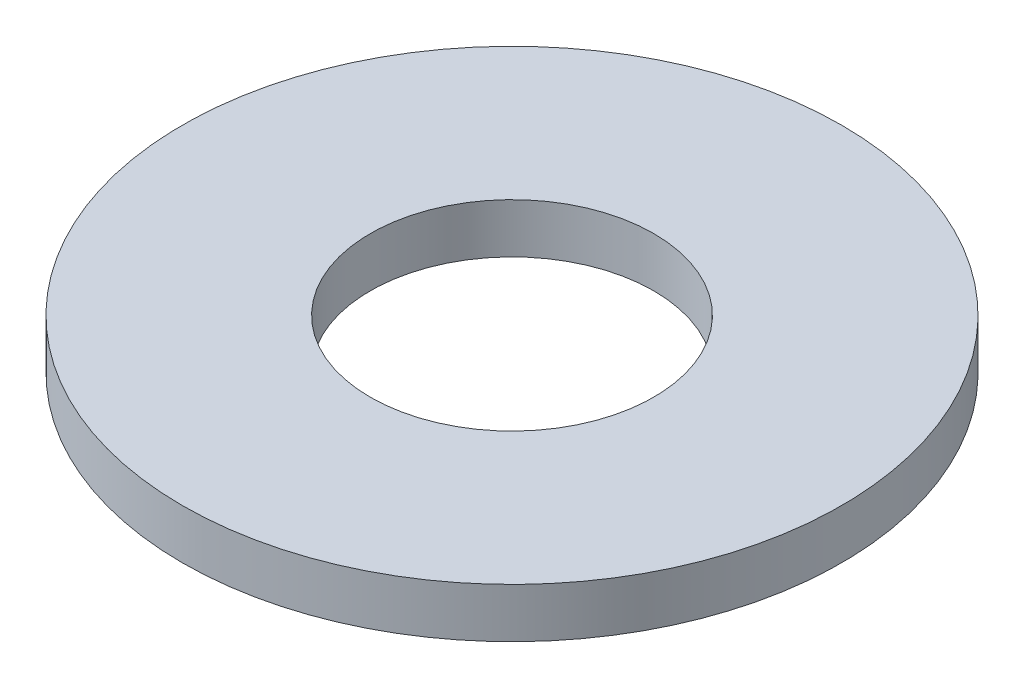
ISO-10303-21;
HEADER;
FILE_DESCRIPTION(('STEP AP214'),'2;1');
FILE_NAME('part.step','',(''),(''),'','','');
FILE_SCHEMA(('AUTOMOTIVE_DESIGN { 1 0 10303 214 1 1 1 1 }'));
ENDSEC;
DATA;
#1=APPLICATION_CONTEXT('core data for automotive mechanical design processes');
#2=APPLICATION_PROTOCOL_DEFINITION('international standard','automotive_design',2000,#1);
#3=PRODUCT_CONTEXT('',#1,'mechanical');
#4=PRODUCT('Part','Part','',(#3));
#5=PRODUCT_RELATED_PRODUCT_CATEGORY('part','',(#4));
#6=PRODUCT_DEFINITION_FORMATION('','',#4);
#7=PRODUCT_DEFINITION_CONTEXT('part definition',#1,'design');
#8=PRODUCT_DEFINITION('design','',#6,#7);
#9=PRODUCT_DEFINITION_SHAPE('','',#8);
#10=(LENGTH_UNIT() NAMED_UNIT(*) SI_UNIT(.MILLI.,.METRE.));
#11=(NAMED_UNIT(*) PLANE_ANGLE_UNIT() SI_UNIT($,.RADIAN.));
#12=(NAMED_UNIT(*) SI_UNIT($,.STERADIAN.) SOLID_ANGLE_UNIT());
#13=UNCERTAINTY_MEASURE_WITH_UNIT(LENGTH_MEASURE(1.E-05),#10,'distance_accuracy_value','');
#14=(GEOMETRIC_REPRESENTATION_CONTEXT(3) GLOBAL_UNCERTAINTY_ASSIGNED_CONTEXT((#13)) GLOBAL_UNIT_ASSIGNED_CONTEXT((#10,
#11,#12)) REPRESENTATION_CONTEXT('',''));
#15=CARTESIAN_POINT('',(0.,0.,0.));
#16=DIRECTION('',(0.,0.,1.));
#17=DIRECTION('',(1.,0.,0.));
#18=AXIS2_PLACEMENT_3D('',#15,#16,#17);
#19=CARTESIAN_POINT('',(0.,1.4,0.));
#20=DIRECTION('',(0.,1.,0.));
#21=DIRECTION('',(0.,0.,1.));
#22=AXIS2_PLACEMENT_3D('',#19,#20,#21);
#23=PLANE('',#22);
#24=CARTESIAN_POINT('',(0.,1.4,0.));
#25=DIRECTION('',(0.,1.,0.));
#26=DIRECTION('',(0.,0.,1.));
#27=AXIS2_PLACEMENT_3D('',#24,#25,#26);
#28=CIRCLE('',#27,9.3);
#29=CARTESIAN_POINT('',(0.,1.4,9.3));
#30=VERTEX_POINT('',#29);
#31=EDGE_CURVE('E10',#30,#30,#28,.T.);
#32=ORIENTED_EDGE('',*,*,#31,.T.);
#33=EDGE_LOOP('',(#32));
#34=FACE_BOUND('',#33,.T.);
#35=CARTESIAN_POINT('',(0.,1.4,0.));
#36=DIRECTION('',(0.,1.,0.));
#37=DIRECTION('',(0.,0.,1.));
#38=AXIS2_PLACEMENT_3D('',#35,#36,#37);
#39=CIRCLE('',#38,4.);
#40=CARTESIAN_POINT('',(0.,1.4,4.));
#41=VERTEX_POINT('',#40);
#42=EDGE_CURVE('E50',#41,#41,#39,.T.);
#43=ORIENTED_EDGE('',*,*,#42,.F.);
#44=EDGE_LOOP('',(#43));
#45=FACE_BOUND('',#44,.T.);
#46=ADVANCED_FACE('F37',(#34,#45),#23,.T.);
#47=CARTESIAN_POINT('',(0.,0.,0.));
#48=DIRECTION('',(0.,1.,0.));
#49=DIRECTION('',(0.,0.,1.));
#50=AXIS2_PLACEMENT_3D('',#47,#48,#49);
#51=PLANE('',#50);
#52=CARTESIAN_POINT('',(0.,0.,0.));
#53=DIRECTION('',(0.,1.,0.));
#54=DIRECTION('',(0.,0.,1.));
#55=AXIS2_PLACEMENT_3D('',#52,#53,#54);
#56=CIRCLE('',#55,9.3);
#57=CARTESIAN_POINT('',(0.,0.,9.3));
#58=VERTEX_POINT('',#57);
#59=EDGE_CURVE('E41',#58,#58,#56,.T.);
#60=ORIENTED_EDGE('',*,*,#59,.F.);
#61=EDGE_LOOP('',(#60));
#62=FACE_BOUND('',#61,.T.);
#63=CARTESIAN_POINT('',(0.,0.,0.));
#64=DIRECTION('',(0.,1.,0.));
#65=DIRECTION('',(0.,0.,1.));
#66=AXIS2_PLACEMENT_3D('',#63,#64,#65);
#67=CIRCLE('',#66,4.);
#68=CARTESIAN_POINT('',(0.,0.,4.));
#69=VERTEX_POINT('',#68);
#70=EDGE_CURVE('E52',#69,#69,#67,.T.);
#71=ORIENTED_EDGE('',*,*,#70,.T.);
#72=EDGE_LOOP('',(#71));
#73=FACE_BOUND('',#72,.T.);
#74=ADVANCED_FACE('F64',(#62,#73),#51,.F.);
#75=CARTESIAN_POINT('',(0.,1.4,0.));
#76=DIRECTION('',(0.,-1.,0.));
#77=DIRECTION('',(0.,0.,-1.));
#78=AXIS2_PLACEMENT_3D('',#75,#76,#77);
#79=CYLINDRICAL_SURFACE('',#78,9.3);
#80=ORIENTED_EDGE('',*,*,#31,.F.);
#81=EDGE_LOOP('',(#80));
#82=FACE_BOUND('',#81,.T.);
#83=ORIENTED_EDGE('',*,*,#59,.T.);
#84=EDGE_LOOP('',(#83));
#85=FACE_BOUND('',#84,.T.);
#86=ADVANCED_FACE('F39',(#82,#85),#79,.T.);
#87=CARTESIAN_POINT('',(0.,1.4,0.));
#88=DIRECTION('',(0.,-1.,0.));
#89=DIRECTION('',(0.,0.,-1.));
#90=AXIS2_PLACEMENT_3D('',#87,#88,#89);
#91=CYLINDRICAL_SURFACE('',#90,4.);
#92=ORIENTED_EDGE('',*,*,#42,.T.);
#93=EDGE_LOOP('',(#92));
#94=FACE_BOUND('',#93,.T.);
#95=ORIENTED_EDGE('',*,*,#70,.F.);
#96=EDGE_LOOP('',(#95));
#97=FACE_BOUND('',#96,.T.);
#98=ADVANCED_FACE('F60',(#94,#97),#91,.F.);
#99=CLOSED_SHELL('',(#46,#74,#86,#98));
#100=MANIFOLD_SOLID_BREP('B2',#99);
#101=ADVANCED_BREP_SHAPE_REPRESENTATION('',(#18,#100),#14);
#102=SHAPE_DEFINITION_REPRESENTATION(#9,#101);
ENDSEC;
END-ISO-10303-21;
